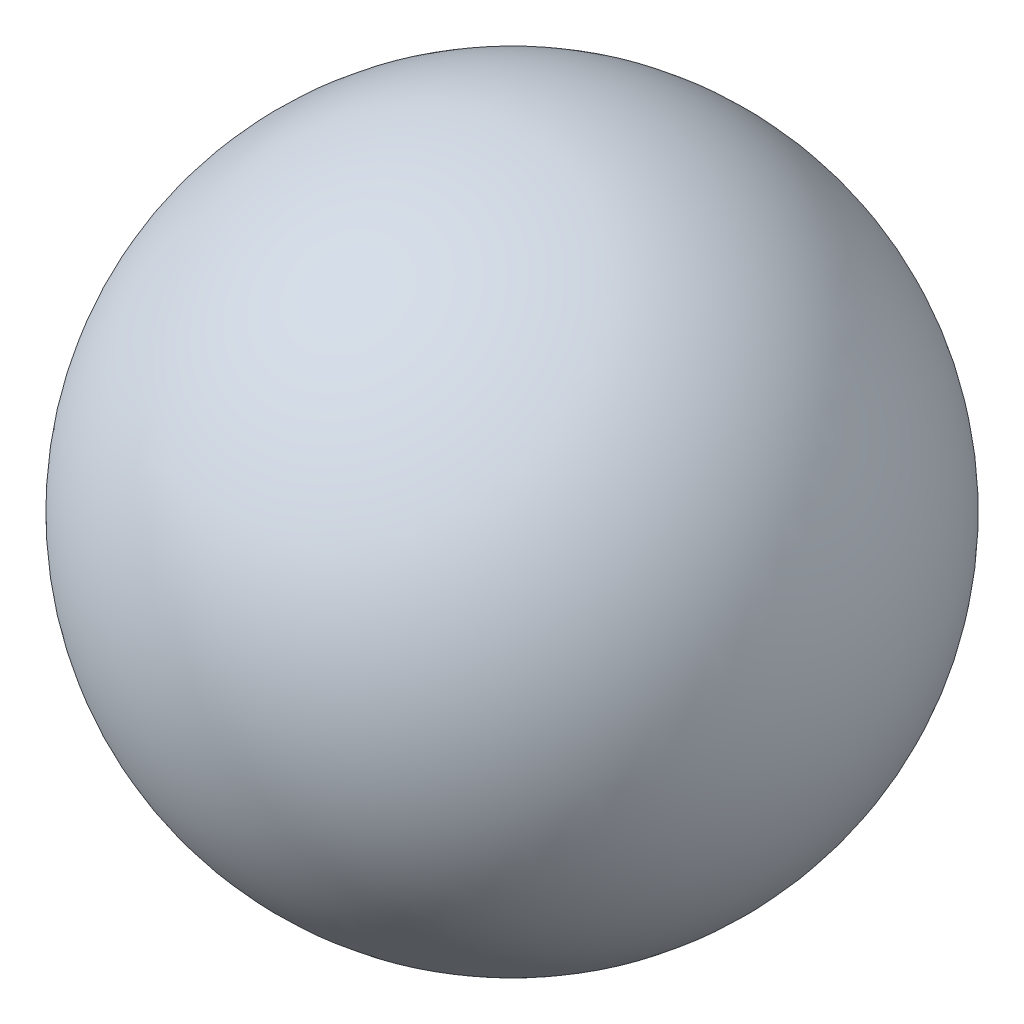
ISO-10303-21;
HEADER;
FILE_DESCRIPTION(('STEP AP214'),'2;1');
FILE_NAME('part.step','',(''),(''),'','','');
FILE_SCHEMA(('AUTOMOTIVE_DESIGN { 1 0 10303 214 1 1 1 1 }'));
ENDSEC;
DATA;
#1=APPLICATION_CONTEXT('core data for automotive mechanical design processes');
#2=APPLICATION_PROTOCOL_DEFINITION('international standard','automotive_design',2000,#1);
#3=PRODUCT_CONTEXT('',#1,'mechanical');
#4=PRODUCT('Part','Part','',(#3));
#5=PRODUCT_RELATED_PRODUCT_CATEGORY('part','',(#4));
#6=PRODUCT_DEFINITION_FORMATION('','',#4);
#7=PRODUCT_DEFINITION_CONTEXT('part definition',#1,'design');
#8=PRODUCT_DEFINITION('design','',#6,#7);
#9=PRODUCT_DEFINITION_SHAPE('','',#8);
#10=(LENGTH_UNIT() NAMED_UNIT(*) SI_UNIT(.MILLI.,.METRE.));
#11=(NAMED_UNIT(*) PLANE_ANGLE_UNIT() SI_UNIT($,.RADIAN.));
#12=(NAMED_UNIT(*) SI_UNIT($,.STERADIAN.) SOLID_ANGLE_UNIT());
#13=UNCERTAINTY_MEASURE_WITH_UNIT(LENGTH_MEASURE(1.E-05),#10,'distance_accuracy_value','');
#14=(GEOMETRIC_REPRESENTATION_CONTEXT(3) GLOBAL_UNCERTAINTY_ASSIGNED_CONTEXT((#13)) GLOBAL_UNIT_ASSIGNED_CONTEXT((#10,
#11,#12)) REPRESENTATION_CONTEXT('',''));
#15=CARTESIAN_POINT('',(0.,0.,0.));
#16=DIRECTION('',(0.,0.,1.));
#17=DIRECTION('',(1.,0.,0.));
#18=AXIS2_PLACEMENT_3D('',#15,#16,#17);
#19=CARTESIAN_POINT('',(0.,0.,0.));
#20=DIRECTION('',(0.,1.,0.));
#21=DIRECTION('',(1.,0.,0.));
#22=AXIS2_PLACEMENT_3D('',#19,#20,#21);
#23=SPHERICAL_SURFACE('',#22,2.921);
#24=CARTESIAN_POINT('',(0.,2.921,0.));
#25=VERTEX_POINT('',#24);
#26=VERTEX_LOOP('',#25);
#27=FACE_BOUND('',#26,.T.);
#28=ADVANCED_FACE('F29',(#27),#23,.T.);
#29=CLOSED_SHELL('',(#28));
#30=MANIFOLD_SOLID_BREP('B2',#29);
#31=ADVANCED_BREP_SHAPE_REPRESENTATION('',(#18,#30),#14);
#32=SHAPE_DEFINITION_REPRESENTATION(#9,#31);
ENDSEC;
END-ISO-10303-21;
